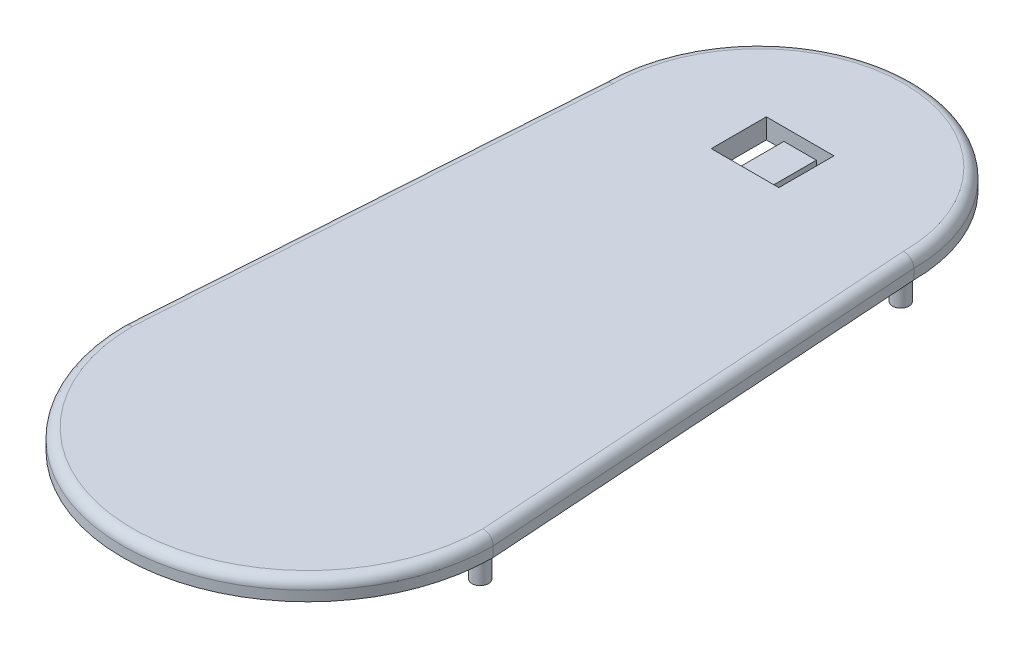
ISO-10303-21;
HEADER;
FILE_DESCRIPTION(('STEP AP214'),'2;1');
FILE_NAME('part.step','',(''),(''),'','','');
FILE_SCHEMA(('AUTOMOTIVE_DESIGN { 1 0 10303 214 1 1 1 1 }'));
ENDSEC;
DATA;
#1=APPLICATION_CONTEXT('core data for automotive mechanical design processes');
#2=APPLICATION_PROTOCOL_DEFINITION('international standard','automotive_design',2000,#1);
#3=PRODUCT_CONTEXT('',#1,'mechanical');
#4=PRODUCT('Part','Part','',(#3));
#5=PRODUCT_RELATED_PRODUCT_CATEGORY('part','',(#4));
#6=PRODUCT_DEFINITION_FORMATION('','',#4);
#7=PRODUCT_DEFINITION_CONTEXT('part definition',#1,'design');
#8=PRODUCT_DEFINITION('design','',#6,#7);
#9=PRODUCT_DEFINITION_SHAPE('','',#8);
#10=(LENGTH_UNIT() NAMED_UNIT(*) SI_UNIT(.MILLI.,.METRE.));
#11=(NAMED_UNIT(*) PLANE_ANGLE_UNIT() SI_UNIT($,.RADIAN.));
#12=(NAMED_UNIT(*) SI_UNIT($,.STERADIAN.) SOLID_ANGLE_UNIT());
#13=UNCERTAINTY_MEASURE_WITH_UNIT(LENGTH_MEASURE(1.E-05),#10,'distance_accuracy_value','');
#14=(GEOMETRIC_REPRESENTATION_CONTEXT(3) GLOBAL_UNCERTAINTY_ASSIGNED_CONTEXT((#13)) GLOBAL_UNIT_ASSIGNED_CONTEXT((#10,
#11,#12)) REPRESENTATION_CONTEXT('',''));
#15=CARTESIAN_POINT('',(0.,0.,0.));
#16=DIRECTION('',(0.,0.,1.));
#17=DIRECTION('',(1.,0.,0.));
#18=AXIS2_PLACEMENT_3D('',#15,#16,#17);
#19=CARTESIAN_POINT('',(33.8495575221239,4.,-2.25663716814159));
#20=DIRECTION('',(0.997785157856609,0.,-0.066519010523774));
#21=DIRECTION('',(-0.066519010523774,0.,-0.997785157856609));
#22=AXIS2_PLACEMENT_3D('',#19,#20,#21);
#23=PLANE('',#22);
#24=DIRECTION('',(0.,-1.,0.));
#25=VECTOR('',#24,1.);
#26=CARTESIAN_POINT('',(31.,4.,-45.));
#27=LINE('',#26,#25);
#28=CARTESIAN_POINT('',(31.,2.,-45.));
#29=VERTEX_POINT('',#28);
#30=CARTESIAN_POINT('',(31.,0.,-45.));
#31=VERTEX_POINT('',#30);
#32=EDGE_CURVE('E254',#29,#31,#27,.T.);
#33=ORIENTED_EDGE('',*,*,#32,.F.);
#34=DIRECTION('',(0.066519010523774,0.,0.997785157856609));
#35=VECTOR('',#34,1.);
#36=CARTESIAN_POINT('',(33.8495575221239,2.,-2.25663716814159));
#37=LINE('',#36,#35);
#38=CARTESIAN_POINT('',(37.,2.,45.));
#39=VERTEX_POINT('',#38);
#40=EDGE_CURVE('E74',#29,#39,#37,.T.);
#41=ORIENTED_EDGE('',*,*,#40,.T.);
#42=DIRECTION('',(0.,-1.,0.));
#43=VECTOR('',#42,1.);
#44=CARTESIAN_POINT('',(37.,4.,45.));
#45=LINE('',#44,#43);
#46=CARTESIAN_POINT('',(37.,0.,45.));
#47=VERTEX_POINT('',#46);
#48=EDGE_CURVE('E245',#39,#47,#45,.T.);
#49=ORIENTED_EDGE('',*,*,#48,.T.);
#50=DIRECTION('',(0.066519010523774,0.,0.997785157856609));
#51=VECTOR('',#50,1.);
#52=CARTESIAN_POINT('',(33.8495575221239,0.,-2.25663716814159));
#53=LINE('',#52,#51);
#54=EDGE_CURVE('E229',#31,#47,#53,.T.);
#55=ORIENTED_EDGE('',*,*,#54,.F.);
#56=EDGE_LOOP('',(#33,#41,#49,#55));
#57=FACE_BOUND('',#56,.T.);
#58=ADVANCED_FACE('F44',(#57),#23,.T.);
#59=CARTESIAN_POINT('',(0.,4.,-45.));
#60=DIRECTION('',(0.,-1.,0.));
#61=DIRECTION('',(0.,0.,-1.));
#62=AXIS2_PLACEMENT_3D('',#59,#60,#61);
#63=CYLINDRICAL_SURFACE('',#62,31.);
#64=DIRECTION('',(0.,-1.,0.));
#65=VECTOR('',#64,1.);
#66=CARTESIAN_POINT('',(-31.,4.,-45.));
#67=LINE('',#66,#65);
#68=CARTESIAN_POINT('',(-31.,2.,-45.));
#69=VERTEX_POINT('',#68);
#70=CARTESIAN_POINT('',(-31.,0.,-45.));
#71=VERTEX_POINT('',#70);
#72=EDGE_CURVE('E251',#69,#71,#67,.T.);
#73=ORIENTED_EDGE('',*,*,#72,.F.);
#74=CARTESIAN_POINT('',(0.,2.,-45.));
#75=DIRECTION('',(0.,1.,0.));
#76=DIRECTION('',(0.,0.,1.));
#77=AXIS2_PLACEMENT_3D('',#74,#75,#76);
#78=CIRCLE('',#77,31.);
#79=EDGE_CURVE('E315',#69,#29,#78,.F.);
#80=ORIENTED_EDGE('',*,*,#79,.T.);
#81=ORIENTED_EDGE('',*,*,#32,.T.);
#82=CARTESIAN_POINT('',(0.,0.,-45.));
#83=DIRECTION('',(0.,1.,0.));
#84=DIRECTION('',(0.,0.,1.));
#85=AXIS2_PLACEMENT_3D('',#82,#83,#84);
#86=CIRCLE('',#85,31.);
#87=EDGE_CURVE('E233',#31,#71,#86,.T.);
#88=ORIENTED_EDGE('',*,*,#87,.T.);
#89=EDGE_LOOP('',(#73,#80,#81,#88));
#90=FACE_BOUND('',#89,.T.);
#91=ADVANCED_FACE('F358',(#90),#63,.T.);
#92=CARTESIAN_POINT('',(-33.8495575221239,4.,-2.25663716814159));
#93=DIRECTION('',(0.997785157856609,0.,0.0665190105237738));
#94=DIRECTION('',(0.0665190105237738,0.,-0.997785157856609));
#95=AXIS2_PLACEMENT_3D('',#92,#93,#94);
#96=PLANE('',#95);
#97=DIRECTION('',(0.,-1.,0.));
#98=VECTOR('',#97,1.);
#99=CARTESIAN_POINT('',(-37.,4.,45.));
#100=LINE('',#99,#98);
#101=CARTESIAN_POINT('',(-37.,2.,45.));
#102=VERTEX_POINT('',#101);
#103=CARTESIAN_POINT('',(-37.,0.,45.));
#104=VERTEX_POINT('',#103);
#105=EDGE_CURVE('E248',#102,#104,#100,.T.);
#106=ORIENTED_EDGE('',*,*,#105,.F.);
#107=DIRECTION('',(-0.0665190105237738,0.,0.997785157856609));
#108=VECTOR('',#107,1.);
#109=CARTESIAN_POINT('',(-31.,2.,-45.));
#110=LINE('',#109,#108);
#111=EDGE_CURVE('E11',#102,#69,#110,.F.);
#112=ORIENTED_EDGE('',*,*,#111,.T.);
#113=ORIENTED_EDGE('',*,*,#72,.T.);
#114=DIRECTION('',(-0.0665190105237738,0.,0.997785157856609));
#115=VECTOR('',#114,1.);
#116=CARTESIAN_POINT('',(-33.8495575221239,0.,-2.25663716814159));
#117=LINE('',#116,#115);
#118=EDGE_CURVE('E237',#71,#104,#117,.T.);
#119=ORIENTED_EDGE('',*,*,#118,.T.);
#120=EDGE_LOOP('',(#106,#112,#113,#119));
#121=FACE_BOUND('',#120,.T.);
#122=ADVANCED_FACE('F363',(#121),#96,.F.);
#123=CARTESIAN_POINT('',(0.,4.,45.));
#124=DIRECTION('',(0.,-1.,0.));
#125=DIRECTION('',(0.,0.,-1.));
#126=AXIS2_PLACEMENT_3D('',#123,#124,#125);
#127=CYLINDRICAL_SURFACE('',#126,37.);
#128=ORIENTED_EDGE('',*,*,#48,.F.);
#129=CARTESIAN_POINT('',(0.,2.,45.));
#130=DIRECTION('',(0.,1.,0.));
#131=DIRECTION('',(0.,0.,1.));
#132=AXIS2_PLACEMENT_3D('',#129,#130,#131);
#133=CIRCLE('',#132,37.);
#134=EDGE_CURVE('E59',#39,#102,#133,.F.);
#135=ORIENTED_EDGE('',*,*,#134,.T.);
#136=ORIENTED_EDGE('',*,*,#105,.T.);
#137=CARTESIAN_POINT('',(0.,0.,45.));
#138=DIRECTION('',(0.,1.,0.));
#139=DIRECTION('',(0.,0.,1.));
#140=AXIS2_PLACEMENT_3D('',#137,#138,#139);
#141=CIRCLE('',#140,37.);
#142=EDGE_CURVE('E241',#104,#47,#141,.T.);
#143=ORIENTED_EDGE('',*,*,#142,.T.);
#144=EDGE_LOOP('',(#128,#135,#136,#143));
#145=FACE_BOUND('',#144,.T.);
#146=ADVANCED_FACE('F369',(#145),#127,.T.);
#147=CARTESIAN_POINT('',(0.,4.,0.));
#148=DIRECTION('',(0.,1.,0.));
#149=DIRECTION('',(0.,0.,1.));
#150=AXIS2_PLACEMENT_3D('',#147,#148,#149);
#151=PLANE('',#150);
#152=DIRECTION('',(0.066519010523774,0.,0.997785157856609));
#153=VECTOR('',#152,1.);
#154=CARTESIAN_POINT('',(31.8539872064107,4.,-2.12359914709405));
#155=LINE('',#154,#153);
#156=CARTESIAN_POINT('',(34.9999383945893,4.,45.0656686755856));
#157=VERTEX_POINT('',#156);
#158=CARTESIAN_POINT('',(28.9999260667579,4.,-44.9345162418861));
#159=VERTEX_POINT('',#158);
#160=EDGE_CURVE('E308',#157,#159,#155,.F.);
#161=ORIENTED_EDGE('',*,*,#160,.T.);
#162=CARTESIAN_POINT('',(0.,4.,-45.));
#163=DIRECTION('',(0.,1.,0.));
#164=DIRECTION('',(0.,0.,1.));
#165=AXIS2_PLACEMENT_3D('',#162,#163,#164);
#166=CIRCLE('',#165,29.);
#167=CARTESIAN_POINT('',(-28.9999260667579,4.,-44.9345162418859));
#168=VERTEX_POINT('',#167);
#169=EDGE_CURVE('E311',#159,#168,#166,.T.);
#170=ORIENTED_EDGE('',*,*,#169,.T.);
#171=DIRECTION('',(-0.0665190105237738,0.,0.997785157856609));
#172=VECTOR('',#171,1.);
#173=CARTESIAN_POINT('',(-35.0044296842868,4.,45.1330380210476));
#174=LINE('',#173,#172);
#175=CARTESIAN_POINT('',(-34.9999383945893,4.,45.0656686755856));
#176=VERTEX_POINT('',#175);
#177=EDGE_CURVE('E302',#168,#176,#174,.T.);
#178=ORIENTED_EDGE('',*,*,#177,.T.);
#179=CARTESIAN_POINT('',(0.,4.,45.));
#180=DIRECTION('',(0.,1.,0.));
#181=DIRECTION('',(0.,0.,1.));
#182=AXIS2_PLACEMENT_3D('',#179,#180,#181);
#183=CIRCLE('',#182,35.);
#184=EDGE_CURVE('E305',#176,#157,#183,.T.);
#185=ORIENTED_EDGE('',*,*,#184,.T.);
#186=EDGE_LOOP('',(#161,#170,#178,#185));
#187=FACE_BOUND('',#186,.T.);
#188=DIRECTION('',(0.,0.,-1.));
#189=VECTOR('',#188,1.);
#190=CARTESIAN_POINT('',(5.54341179462731,4.,-54.5081882234437));
#191=LINE('',#190,#189);
#192=CARTESIAN_POINT('',(5.54341179462731,4.,-43.5081882234437));
#193=VERTEX_POINT('',#192);
#194=CARTESIAN_POINT('',(5.54341179462731,4.,-54.5081882234437));
#195=VERTEX_POINT('',#194);
#196=EDGE_CURVE('E164',#193,#195,#191,.T.);
#197=ORIENTED_EDGE('',*,*,#196,.F.);
#198=DIRECTION('',(1.,0.,0.));
#199=VECTOR('',#198,1.);
#200=CARTESIAN_POINT('',(-7.95658820537269,4.,-43.5081882234437));
#201=LINE('',#200,#199);
#202=CARTESIAN_POINT('',(-7.95658820537269,4.,-43.5081882234437));
#203=VERTEX_POINT('',#202);
#204=EDGE_CURVE('E181',#203,#193,#201,.T.);
#205=ORIENTED_EDGE('',*,*,#204,.F.);
#206=DIRECTION('',(0.,0.,1.));
#207=VECTOR('',#206,1.);
#208=CARTESIAN_POINT('',(-7.95658820537269,4.,-54.5081882234437));
#209=LINE('',#208,#207);
#210=CARTESIAN_POINT('',(-7.95658820537269,4.,-54.5081882234437));
#211=VERTEX_POINT('',#210);
#212=EDGE_CURVE('E188',#211,#203,#209,.T.);
#213=ORIENTED_EDGE('',*,*,#212,.F.);
#214=DIRECTION('',(-1.,0.,0.));
#215=VECTOR('',#214,1.);
#216=CARTESIAN_POINT('',(-7.95658820537269,4.,-54.5081882234437));
#217=LINE('',#216,#215);
#218=EDGE_CURVE('E195',#195,#211,#217,.T.);
#219=ORIENTED_EDGE('',*,*,#218,.F.);
#220=EDGE_LOOP('',(#197,#205,#213,#219));
#221=FACE_BOUND('',#220,.T.);
#222=ADVANCED_FACE('F373',(#187,#221),#151,.T.);
#223=CARTESIAN_POINT('',(0.,0.,0.));
#224=DIRECTION('',(0.,1.,0.));
#225=DIRECTION('',(0.,0.,1.));
#226=AXIS2_PLACEMENT_3D('',#223,#224,#225);
#227=PLANE('',#226);
#228=DIRECTION('',(-1.,0.,0.));
#229=VECTOR('',#228,1.);
#230=CARTESIAN_POINT('',(0.,0.,-54.5081882234437));
#231=LINE('',#230,#229);
#232=CARTESIAN_POINT('',(-4.45658820537269,0.,-54.5081882234437));
#233=VERTEX_POINT('',#232);
#234=CARTESIAN_POINT('',(-7.95658820537269,0.,-54.5081882234437));
#235=VERTEX_POINT('',#234);
#236=EDGE_CURVE('E159',#233,#235,#231,.T.);
#237=ORIENTED_EDGE('',*,*,#236,.T.);
#238=DIRECTION('',(0.,0.,1.));
#239=VECTOR('',#238,1.);
#240=CARTESIAN_POINT('',(-7.95658820537269,0.,0.));
#241=LINE('',#240,#239);
#242=CARTESIAN_POINT('',(-7.95658820537269,0.,-43.5081882234437));
#243=VERTEX_POINT('',#242);
#244=EDGE_CURVE('E298',#235,#243,#241,.T.);
#245=ORIENTED_EDGE('',*,*,#244,.T.);
#246=DIRECTION('',(1.,0.,0.));
#247=VECTOR('',#246,1.);
#248=CARTESIAN_POINT('',(0.,0.,-43.5081882234437));
#249=LINE('',#248,#247);
#250=CARTESIAN_POINT('',(-4.45658820537269,0.,-43.5081882234437));
#251=VERTEX_POINT('',#250);
#252=EDGE_CURVE('E289',#243,#251,#249,.T.);
#253=ORIENTED_EDGE('',*,*,#252,.T.);
#254=DIRECTION('',(0.,0.,-1.));
#255=VECTOR('',#254,1.);
#256=CARTESIAN_POINT('',(-4.45658820537269,0.,0.));
#257=LINE('',#256,#255);
#258=EDGE_CURVE('E293',#251,#233,#257,.T.);
#259=ORIENTED_EDGE('',*,*,#258,.T.);
#260=EDGE_LOOP('',(#237,#245,#253,#259));
#261=FACE_BOUND('',#260,.T.);
#262=DIRECTION('',(1.,0.,0.));
#263=VECTOR('',#262,1.);
#264=CARTESIAN_POINT('',(0.,0.,-43.5081882234437));
#265=LINE('',#264,#263);
#266=CARTESIAN_POINT('',(2.04341179462731,0.,-43.5081882234437));
#267=VERTEX_POINT('',#266);
#268=CARTESIAN_POINT('',(5.54341179462731,0.,-43.5081882234437));
#269=VERTEX_POINT('',#268);
#270=EDGE_CURVE('E281',#267,#269,#265,.T.);
#271=ORIENTED_EDGE('',*,*,#270,.T.);
#272=DIRECTION('',(0.,0.,-1.));
#273=VECTOR('',#272,1.);
#274=CARTESIAN_POINT('',(5.54341179462731,0.,0.));
#275=LINE('',#274,#273);
#276=CARTESIAN_POINT('',(5.54341179462731,0.,-54.5081882234437));
#277=VERTEX_POINT('',#276);
#278=EDGE_CURVE('E285',#269,#277,#275,.T.);
#279=ORIENTED_EDGE('',*,*,#278,.T.);
#280=DIRECTION('',(-1.,0.,0.));
#281=VECTOR('',#280,1.);
#282=CARTESIAN_POINT('',(0.,0.,-54.5081882234437));
#283=LINE('',#282,#281);
#284=CARTESIAN_POINT('',(2.04341179462731,0.,-54.5081882234437));
#285=VERTEX_POINT('',#284);
#286=EDGE_CURVE('E273',#277,#285,#283,.T.);
#287=ORIENTED_EDGE('',*,*,#286,.T.);
#288=DIRECTION('',(0.,0.,1.));
#289=VECTOR('',#288,1.);
#290=CARTESIAN_POINT('',(2.04341179462731,0.,0.));
#291=LINE('',#290,#289);
#292=EDGE_CURVE('E277',#285,#267,#291,.T.);
#293=ORIENTED_EDGE('',*,*,#292,.T.);
#294=EDGE_LOOP('',(#271,#279,#287,#293));
#295=FACE_BOUND('',#294,.T.);
#296=CARTESIAN_POINT('',(-28.4,0.,-45.));
#297=DIRECTION('',(0.,1.,0.));
#298=DIRECTION('',(0.,0.,1.));
#299=AXIS2_PLACEMENT_3D('',#296,#297,#298);
#300=CIRCLE('',#299,1.65);
#301=CARTESIAN_POINT('',(-28.4,0.,-43.35));
#302=VERTEX_POINT('',#301);
#303=EDGE_CURVE('E269',#302,#302,#300,.F.);
#304=ORIENTED_EDGE('',*,*,#303,.F.);
#305=EDGE_LOOP('',(#304));
#306=FACE_BOUND('',#305,.T.);
#307=CARTESIAN_POINT('',(28.4,0.,-45.));
#308=DIRECTION('',(0.,1.,0.));
#309=DIRECTION('',(0.,0.,1.));
#310=AXIS2_PLACEMENT_3D('',#307,#308,#309);
#311=CIRCLE('',#310,1.65);
#312=CARTESIAN_POINT('',(28.4,0.,-43.35));
#313=VERTEX_POINT('',#312);
#314=EDGE_CURVE('E265',#313,#313,#311,.F.);
#315=ORIENTED_EDGE('',*,*,#314,.F.);
#316=EDGE_LOOP('',(#315));
#317=FACE_BOUND('',#316,.T.);
#318=CARTESIAN_POINT('',(34.4,0.,45.));
#319=DIRECTION('',(0.,1.,0.));
#320=DIRECTION('',(0.,0.,1.));
#321=AXIS2_PLACEMENT_3D('',#318,#319,#320);
#322=CIRCLE('',#321,1.65);
#323=CARTESIAN_POINT('',(34.4,0.,46.65));
#324=VERTEX_POINT('',#323);
#325=EDGE_CURVE('E261',#324,#324,#322,.F.);
#326=ORIENTED_EDGE('',*,*,#325,.F.);
#327=EDGE_LOOP('',(#326));
#328=FACE_BOUND('',#327,.T.);
#329=CARTESIAN_POINT('',(-34.4,0.,45.));
#330=DIRECTION('',(0.,1.,0.));
#331=DIRECTION('',(0.,0.,1.));
#332=AXIS2_PLACEMENT_3D('',#329,#330,#331);
#333=CIRCLE('',#332,1.65);
#334=CARTESIAN_POINT('',(-34.4,0.,46.65));
#335=VERTEX_POINT('',#334);
#336=EDGE_CURVE('E257',#335,#335,#333,.F.);
#337=ORIENTED_EDGE('',*,*,#336,.F.);
#338=EDGE_LOOP('',(#337));
#339=FACE_BOUND('',#338,.T.);
#340=ORIENTED_EDGE('',*,*,#54,.T.);
#341=ORIENTED_EDGE('',*,*,#142,.F.);
#342=ORIENTED_EDGE('',*,*,#118,.F.);
#343=ORIENTED_EDGE('',*,*,#87,.F.);
#344=EDGE_LOOP('',(#340,#341,#342,#343));
#345=FACE_BOUND('',#344,.T.);
#346=ADVANCED_FACE('F374',(#261,#295,#306,#317,#328,#339,#345),#227,.F.);
#347=CARTESIAN_POINT('',(-34.4,-5.,45.));
#348=DIRECTION('',(0.,1.,0.));
#349=DIRECTION('',(0.,0.,1.));
#350=AXIS2_PLACEMENT_3D('',#347,#348,#349);
#351=CYLINDRICAL_SURFACE('',#350,1.65);
#352=CARTESIAN_POINT('',(-34.4,-5.,45.));
#353=DIRECTION('',(0.,-1.,0.));
#354=DIRECTION('',(0.,0.,-1.));
#355=AXIS2_PLACEMENT_3D('',#352,#353,#354);
#356=CIRCLE('',#355,1.65);
#357=CARTESIAN_POINT('',(-34.4,-5.,43.35));
#358=VERTEX_POINT('',#357);
#359=EDGE_CURVE('E225',#358,#358,#356,.T.);
#360=ORIENTED_EDGE('',*,*,#359,.F.);
#361=EDGE_LOOP('',(#360));
#362=FACE_BOUND('',#361,.T.);
#363=ORIENTED_EDGE('',*,*,#336,.T.);
#364=EDGE_LOOP('',(#363));
#365=FACE_BOUND('',#364,.T.);
#366=ADVANCED_FACE('F377',(#362,#365),#351,.T.);
#367=CARTESIAN_POINT('',(-34.4,-5.,45.));
#368=DIRECTION('',(0.,-1.,0.));
#369=DIRECTION('',(0.,0.,-1.));
#370=AXIS2_PLACEMENT_3D('',#367,#368,#369);
#371=PLANE('',#370);
#372=ORIENTED_EDGE('',*,*,#359,.T.);
#373=EDGE_LOOP('',(#372));
#374=FACE_BOUND('',#373,.T.);
#375=ADVANCED_FACE('F384',(#374),#371,.T.);
#376=CARTESIAN_POINT('',(34.4,-5.,45.));
#377=DIRECTION('',(0.,1.,0.));
#378=DIRECTION('',(0.,0.,1.));
#379=AXIS2_PLACEMENT_3D('',#376,#377,#378);
#380=CYLINDRICAL_SURFACE('',#379,1.65);
#381=CARTESIAN_POINT('',(34.4,-5.,45.));
#382=DIRECTION('',(0.,-1.,0.));
#383=DIRECTION('',(0.,0.,-1.));
#384=AXIS2_PLACEMENT_3D('',#381,#382,#383);
#385=CIRCLE('',#384,1.65);
#386=CARTESIAN_POINT('',(34.4,-5.,43.35));
#387=VERTEX_POINT('',#386);
#388=EDGE_CURVE('E221',#387,#387,#385,.T.);
#389=ORIENTED_EDGE('',*,*,#388,.F.);
#390=EDGE_LOOP('',(#389));
#391=FACE_BOUND('',#390,.T.);
#392=ORIENTED_EDGE('',*,*,#325,.T.);
#393=EDGE_LOOP('',(#392));
#394=FACE_BOUND('',#393,.T.);
#395=ADVANCED_FACE('F388',(#391,#394),#380,.T.);
#396=CARTESIAN_POINT('',(34.4,-5.,45.));
#397=DIRECTION('',(0.,-1.,0.));
#398=DIRECTION('',(0.,0.,-1.));
#399=AXIS2_PLACEMENT_3D('',#396,#397,#398);
#400=PLANE('',#399);
#401=ORIENTED_EDGE('',*,*,#388,.T.);
#402=EDGE_LOOP('',(#401));
#403=FACE_BOUND('',#402,.T.);
#404=ADVANCED_FACE('F390',(#403),#400,.T.);
#405=CARTESIAN_POINT('',(28.4,-5.,-45.));
#406=DIRECTION('',(0.,1.,0.));
#407=DIRECTION('',(0.,0.,1.));
#408=AXIS2_PLACEMENT_3D('',#405,#406,#407);
#409=CYLINDRICAL_SURFACE('',#408,1.65);
#410=CARTESIAN_POINT('',(28.4,-5.,-45.));
#411=DIRECTION('',(0.,-1.,0.));
#412=DIRECTION('',(0.,0.,-1.));
#413=AXIS2_PLACEMENT_3D('',#410,#411,#412);
#414=CIRCLE('',#413,1.65);
#415=CARTESIAN_POINT('',(28.4,-5.,-46.65));
#416=VERTEX_POINT('',#415);
#417=EDGE_CURVE('E217',#416,#416,#414,.T.);
#418=ORIENTED_EDGE('',*,*,#417,.F.);
#419=EDGE_LOOP('',(#418));
#420=FACE_BOUND('',#419,.T.);
#421=ORIENTED_EDGE('',*,*,#314,.T.);
#422=EDGE_LOOP('',(#421));
#423=FACE_BOUND('',#422,.T.);
#424=ADVANCED_FACE('F393',(#420,#423),#409,.T.);
#425=CARTESIAN_POINT('',(28.4,-5.,-45.));
#426=DIRECTION('',(0.,-1.,0.));
#427=DIRECTION('',(0.,0.,-1.));
#428=AXIS2_PLACEMENT_3D('',#425,#426,#427);
#429=PLANE('',#428);
#430=ORIENTED_EDGE('',*,*,#417,.T.);
#431=EDGE_LOOP('',(#430));
#432=FACE_BOUND('',#431,.T.);
#433=ADVANCED_FACE('F398',(#432),#429,.T.);
#434=CARTESIAN_POINT('',(-28.4,-5.,-45.));
#435=DIRECTION('',(0.,1.,0.));
#436=DIRECTION('',(0.,0.,1.));
#437=AXIS2_PLACEMENT_3D('',#434,#435,#436);
#438=CYLINDRICAL_SURFACE('',#437,1.65);
#439=CARTESIAN_POINT('',(-28.4,-5.,-45.));
#440=DIRECTION('',(0.,-1.,0.));
#441=DIRECTION('',(0.,0.,-1.));
#442=AXIS2_PLACEMENT_3D('',#439,#440,#441);
#443=CIRCLE('',#442,1.65);
#444=CARTESIAN_POINT('',(-28.4,-5.,-46.65));
#445=VERTEX_POINT('',#444);
#446=EDGE_CURVE('E204',#445,#445,#443,.T.);
#447=ORIENTED_EDGE('',*,*,#446,.F.);
#448=EDGE_LOOP('',(#447));
#449=FACE_BOUND('',#448,.T.);
#450=ORIENTED_EDGE('',*,*,#303,.T.);
#451=EDGE_LOOP('',(#450));
#452=FACE_BOUND('',#451,.T.);
#453=ADVANCED_FACE('F401',(#449,#452),#438,.T.);
#454=CARTESIAN_POINT('',(-28.4,-5.,-45.));
#455=DIRECTION('',(0.,-1.,0.));
#456=DIRECTION('',(0.,0.,-1.));
#457=AXIS2_PLACEMENT_3D('',#454,#455,#456);
#458=PLANE('',#457);
#459=ORIENTED_EDGE('',*,*,#446,.T.);
#460=EDGE_LOOP('',(#459));
#461=FACE_BOUND('',#460,.T.);
#462=ADVANCED_FACE('F406',(#461),#458,.T.);
#463=CARTESIAN_POINT('',(5.54341179462731,1.5,-54.5081882234437));
#464=DIRECTION('',(1.,0.,0.));
#465=DIRECTION('',(0.,0.,-1.));
#466=AXIS2_PLACEMENT_3D('',#463,#464,#465);
#467=PLANE('',#466);
#468=ORIENTED_EDGE('',*,*,#196,.T.);
#469=DIRECTION('',(0.,1.,0.));
#470=VECTOR('',#469,1.);
#471=CARTESIAN_POINT('',(5.54341179462731,1.5,-54.5081882234437));
#472=LINE('',#471,#470);
#473=EDGE_CURVE('E185',#277,#195,#472,.T.);
#474=ORIENTED_EDGE('',*,*,#473,.F.);
#475=ORIENTED_EDGE('',*,*,#278,.F.);
#476=DIRECTION('',(0.,1.,0.));
#477=VECTOR('',#476,1.);
#478=CARTESIAN_POINT('',(5.54341179462731,1.5,-43.5081882234437));
#479=LINE('',#478,#477);
#480=EDGE_CURVE('E201',#269,#193,#479,.T.);
#481=ORIENTED_EDGE('',*,*,#480,.T.);
#482=EDGE_LOOP('',(#468,#474,#475,#481));
#483=FACE_BOUND('',#482,.T.);
#484=ADVANCED_FACE('F409',(#483),#467,.F.);
#485=CARTESIAN_POINT('',(-7.95658820537269,1.5,-43.5081882234437));
#486=DIRECTION('',(0.,0.,1.));
#487=DIRECTION('',(1.,0.,0.));
#488=AXIS2_PLACEMENT_3D('',#485,#486,#487);
#489=PLANE('',#488);
#490=ORIENTED_EDGE('',*,*,#204,.T.);
#491=ORIENTED_EDGE('',*,*,#480,.F.);
#492=ORIENTED_EDGE('',*,*,#270,.F.);
#493=DIRECTION('',(0.,1.,0.));
#494=VECTOR('',#493,1.);
#495=CARTESIAN_POINT('',(2.04341179462731,-7.,-43.5081882234437));
#496=LINE('',#495,#494);
#497=CARTESIAN_POINT('',(2.04341179462731,1.5,-43.5081882234437));
#498=VERTEX_POINT('',#497);
#499=EDGE_CURVE('E670',#267,#498,#496,.T.);
#500=ORIENTED_EDGE('',*,*,#499,.T.);
#501=DIRECTION('',(1.,0.,0.));
#502=VECTOR('',#501,1.);
#503=CARTESIAN_POINT('',(-7.95658820537269,1.5,-43.5081882234437));
#504=LINE('',#503,#502);
#505=CARTESIAN_POINT('',(-4.45658820537269,1.5,-43.5081882234437));
#506=VERTEX_POINT('',#505);
#507=EDGE_CURVE('E180',#506,#498,#504,.T.);
#508=ORIENTED_EDGE('',*,*,#507,.F.);
#509=DIRECTION('',(0.,1.,0.));
#510=VECTOR('',#509,1.);
#511=CARTESIAN_POINT('',(-4.45658820537269,-7.,-43.5081882234437));
#512=LINE('',#511,#510);
#513=EDGE_CURVE('E165',#251,#506,#512,.T.);
#514=ORIENTED_EDGE('',*,*,#513,.F.);
#515=ORIENTED_EDGE('',*,*,#252,.F.);
#516=DIRECTION('',(0.,1.,0.));
#517=VECTOR('',#516,1.);
#518=CARTESIAN_POINT('',(-7.95658820537269,1.5,-43.5081882234437));
#519=LINE('',#518,#517);
#520=EDGE_CURVE('E205',#243,#203,#519,.T.);
#521=ORIENTED_EDGE('',*,*,#520,.T.);
#522=EDGE_LOOP('',(#490,#491,#492,#500,#508,#514,#515,#521));
#523=FACE_BOUND('',#522,.T.);
#524=ADVANCED_FACE('F416',(#523),#489,.F.);
#525=CARTESIAN_POINT('',(-7.95658820537269,1.5,-54.5081882234437));
#526=DIRECTION('',(-1.,0.,0.));
#527=DIRECTION('',(0.,0.,1.));
#528=AXIS2_PLACEMENT_3D('',#525,#526,#527);
#529=PLANE('',#528);
#530=ORIENTED_EDGE('',*,*,#212,.T.);
#531=ORIENTED_EDGE('',*,*,#520,.F.);
#532=ORIENTED_EDGE('',*,*,#244,.F.);
#533=DIRECTION('',(0.,1.,0.));
#534=VECTOR('',#533,1.);
#535=CARTESIAN_POINT('',(-7.95658820537269,1.5,-54.5081882234437));
#536=LINE('',#535,#534);
#537=EDGE_CURVE('E208',#235,#211,#536,.T.);
#538=ORIENTED_EDGE('',*,*,#537,.T.);
#539=EDGE_LOOP('',(#530,#531,#532,#538));
#540=FACE_BOUND('',#539,.T.);
#541=ADVANCED_FACE('F420',(#540),#529,.F.);
#542=CARTESIAN_POINT('',(-7.95658820537269,1.5,-54.5081882234437));
#543=DIRECTION('',(0.,0.,-1.));
#544=DIRECTION('',(-1.,0.,0.));
#545=AXIS2_PLACEMENT_3D('',#542,#543,#544);
#546=PLANE('',#545);
#547=ORIENTED_EDGE('',*,*,#218,.T.);
#548=ORIENTED_EDGE('',*,*,#537,.F.);
#549=ORIENTED_EDGE('',*,*,#236,.F.);
#550=DIRECTION('',(0.,1.,0.));
#551=VECTOR('',#550,1.);
#552=CARTESIAN_POINT('',(-4.45658820537269,-7.,-54.5081882234437));
#553=LINE('',#552,#551);
#554=CARTESIAN_POINT('',(-4.45658820537269,1.5,-54.5081882234437));
#555=VERTEX_POINT('',#554);
#556=EDGE_CURVE('E152',#233,#555,#553,.T.);
#557=ORIENTED_EDGE('',*,*,#556,.T.);
#558=DIRECTION('',(-1.,0.,0.));
#559=VECTOR('',#558,1.);
#560=CARTESIAN_POINT('',(-7.95658820537269,1.5,-54.5081882234437));
#561=LINE('',#560,#559);
#562=CARTESIAN_POINT('',(2.04341179462731,1.5,-54.5081882234437));
#563=VERTEX_POINT('',#562);
#564=EDGE_CURVE('E157',#563,#555,#561,.T.);
#565=ORIENTED_EDGE('',*,*,#564,.F.);
#566=DIRECTION('',(0.,1.,0.));
#567=VECTOR('',#566,1.);
#568=CARTESIAN_POINT('',(2.04341179462731,-7.,-54.5081882234437));
#569=LINE('',#568,#567);
#570=EDGE_CURVE('E666',#285,#563,#569,.T.);
#571=ORIENTED_EDGE('',*,*,#570,.F.);
#572=ORIENTED_EDGE('',*,*,#286,.F.);
#573=ORIENTED_EDGE('',*,*,#473,.T.);
#574=EDGE_LOOP('',(#547,#548,#549,#557,#565,#571,#572,#573));
#575=FACE_BOUND('',#574,.T.);
#576=ADVANCED_FACE('F155',(#575),#546,.F.);
#577=CARTESIAN_POINT('',(0.,1.5,0.));
#578=DIRECTION('',(0.,1.,0.));
#579=DIRECTION('',(0.,0.,1.));
#580=AXIS2_PLACEMENT_3D('',#577,#578,#579);
#581=PLANE('',#580);
#582=DIRECTION('',(0.,0.,-1.));
#583=VECTOR('',#582,1.);
#584=CARTESIAN_POINT('',(-4.45658820537269,1.5,-54.5081882234437));
#585=LINE('',#584,#583);
#586=EDGE_CURVE('E168',#506,#555,#585,.T.);
#587=ORIENTED_EDGE('',*,*,#586,.F.);
#588=ORIENTED_EDGE('',*,*,#507,.T.);
#589=DIRECTION('',(0.,0.,1.));
#590=VECTOR('',#589,1.);
#591=CARTESIAN_POINT('',(2.04341179462731,1.5,-54.5081882234437));
#592=LINE('',#591,#590);
#593=EDGE_CURVE('E174',#563,#498,#592,.T.);
#594=ORIENTED_EDGE('',*,*,#593,.F.);
#595=ORIENTED_EDGE('',*,*,#564,.T.);
#596=EDGE_LOOP('',(#587,#588,#594,#595));
#597=FACE_BOUND('',#596,.T.);
#598=ADVANCED_FACE('F177',(#597),#581,.T.);
#599=CARTESIAN_POINT('',(2.04341179462731,-7.,-54.5081882234437));
#600=DIRECTION('',(-1.,0.,0.));
#601=DIRECTION('',(0.,0.,1.));
#602=AXIS2_PLACEMENT_3D('',#599,#600,#601);
#603=PLANE('',#602);
#604=ORIENTED_EDGE('',*,*,#570,.T.);
#605=ORIENTED_EDGE('',*,*,#593,.T.);
#606=ORIENTED_EDGE('',*,*,#499,.F.);
#607=ORIENTED_EDGE('',*,*,#292,.F.);
#608=EDGE_LOOP('',(#604,#605,#606,#607));
#609=FACE_BOUND('',#608,.T.);
#610=ADVANCED_FACE('F429',(#609),#603,.F.);
#611=CARTESIAN_POINT('',(-4.45658820537269,-7.,-54.5081882234437));
#612=DIRECTION('',(1.,0.,0.));
#613=DIRECTION('',(0.,0.,-1.));
#614=AXIS2_PLACEMENT_3D('',#611,#612,#613);
#615=PLANE('',#614);
#616=ORIENTED_EDGE('',*,*,#513,.T.);
#617=ORIENTED_EDGE('',*,*,#586,.T.);
#618=ORIENTED_EDGE('',*,*,#556,.F.);
#619=ORIENTED_EDGE('',*,*,#258,.F.);
#620=EDGE_LOOP('',(#616,#617,#618,#619));
#621=FACE_BOUND('',#620,.T.);
#622=ADVANCED_FACE('F169',(#621),#615,.F.);
#623=CARTESIAN_POINT('',(0.,2.,45.));
#624=DIRECTION('',(0.,1.,0.));
#625=DIRECTION('',(0.,0.,1.));
#626=AXIS2_PLACEMENT_3D('',#623,#624,#625);
#627=TOROIDAL_SURFACE('',#626,35.,2.);
#628=CARTESIAN_POINT('',(-37.,2.,45.));
#629=CARTESIAN_POINT('',(-36.9999996402275,2.05624475087798,44.9999999996362));
#630=CARTESIAN_POINT('',(-36.997625905687,2.11246254691495,45.0000790501016));
#631=CARTESIAN_POINT('',(-36.9881562152748,2.2244957173092,45.0003943310133));
#632=CARTESIAN_POINT('',(-36.9810604904043,2.2803111112171,45.0006305537707));
#633=CARTESIAN_POINT('',(-36.9527569309834,2.44646218662946,45.0015726058552));
#634=CARTESIAN_POINT('',(-36.9245325306133,2.55568457998845,45.0025118256522));
#635=CARTESIAN_POINT('',(-36.8501589887517,2.76783386641287,45.0049844054091));
#636=CARTESIAN_POINT('',(-36.8040013930819,2.87075776367332,45.0065180455937));
#637=CARTESIAN_POINT('',(-36.6950828346633,3.06738474222426,45.010132283248));
#638=CARTESIAN_POINT('',(-36.6323257489039,3.16108996963203,45.0122127529992));
#639=CARTESIAN_POINT('',(-36.4919762583318,3.33664918037004,45.0168579479759));
#640=CARTESIAN_POINT('',(-36.4143810399443,3.41850091088459,45.0194227650412));
#641=CARTESIAN_POINT('',(-36.2465332609208,3.56804608268895,45.02496016205));
#642=CARTESIAN_POINT('',(-36.156276381694,3.63573467356055,45.0279328811116));
#643=CARTESIAN_POINT('',(-35.9656274668812,3.75504849587628,45.0341985909773));
#644=CARTESIAN_POINT('',(-35.8652272642144,3.80666064435226,45.0374918397824));
#645=CARTESIAN_POINT('',(-35.6572352396131,3.89225346192834,45.0442981431823));
#646=CARTESIAN_POINT('',(-35.5496500165224,3.926250064745,45.0478109959046));
#647=CARTESIAN_POINT('',(-35.3734156145736,3.96601536156408,45.0535510965578));
#648=CARTESIAN_POINT('',(-35.3060211778387,3.97762484211189,45.0557429651271));
#649=CARTESIAN_POINT('',(-35.170463755609,3.99388259698973,45.0601449530956));
#650=CARTESIAN_POINT('',(-35.1023020840596,3.99854135463697,45.0623550399442));
#651=CARTESIAN_POINT('',(-35.0227273495584,3.9999028424499,45.0649311929654));
#652=CARTESIAN_POINT('',(-35.011332158401,4.00000025818689,45.065300005429));
#653=CARTESIAN_POINT('',(-34.9999383945892,4.,45.0656686755856));
#654=B_SPLINE_CURVE_WITH_KNOTS('',3,(#628,#629,#630,#631,#632,#633,#634,#635,#636,#637,#638,
#639,#640,#641,#642,#643,#644,#645,#646,#647,#648,#649,#650,#651,#652,#653),.UNSPECIFIED.,.F.,
.F.,(4,2,2,2,2,2,2,2,2,2,2,2,4),(0.,0.168630585363181,0.337252921872603,0.673959084564118,
1.01082417234473,1.34761065102941,1.68446105388208,2.02142662899216,2.35866571368872,
2.69559922205954,2.90056100753187,3.1052133490446,3.13941612864967),.UNSPECIFIED.);
#655=EDGE_CURVE('E677',#102,#176,#654,.T.);
#656=ORIENTED_EDGE('',*,*,#655,.F.);
#657=ORIENTED_EDGE('',*,*,#134,.F.);
#658=CARTESIAN_POINT('',(37.,2.,45.));
#659=CARTESIAN_POINT('',(36.9999996402275,2.05624475087798,44.999999999636));
#660=CARTESIAN_POINT('',(36.997625905687,2.11246254691495,45.0000790501014));
#661=CARTESIAN_POINT('',(36.9881562152748,2.2244957173092,45.0003943310131));
#662=CARTESIAN_POINT('',(36.9810604904043,2.2803111112171,45.0006305537704));
#663=CARTESIAN_POINT('',(36.9527569309834,2.44646218662946,45.001572605855));
#664=CARTESIAN_POINT('',(36.9245325306133,2.55568457998845,45.002511825652));
#665=CARTESIAN_POINT('',(36.8501589887517,2.76783386641287,45.0049844054089));
#666=CARTESIAN_POINT('',(36.8040013930819,2.87075776367332,45.0065180455934));
#667=CARTESIAN_POINT('',(36.6950828346633,3.06738474222426,45.0101322832478));
#668=CARTESIAN_POINT('',(36.6323257489039,3.16108996963203,45.0122127529991));
#669=CARTESIAN_POINT('',(36.4919762583318,3.33664918037004,45.0168579479758));
#670=CARTESIAN_POINT('',(36.4143810399443,3.41850091088459,45.0194227650412));
#671=CARTESIAN_POINT('',(36.2465332609208,3.56804608268895,45.0249601620499));
#672=CARTESIAN_POINT('',(36.156276381694,3.63573467356055,45.0279328811114));
#673=CARTESIAN_POINT('',(35.9656274668812,3.75504849587628,45.034198590977));
#674=CARTESIAN_POINT('',(35.8652272642144,3.80666064435226,45.0374918397822));
#675=CARTESIAN_POINT('',(35.6572352396131,3.89225346192834,45.0442981431822));
#676=CARTESIAN_POINT('',(35.5496500165224,3.926250064745,45.0478109959045));
#677=CARTESIAN_POINT('',(35.3734156145736,3.96601536156408,45.0535510965577));
#678=CARTESIAN_POINT('',(35.3060211778387,3.97762484211188,45.0557429651269));
#679=CARTESIAN_POINT('',(35.170463755609,3.99388259698973,45.0601449530954));
#680=CARTESIAN_POINT('',(35.1023020840596,3.99854135463697,45.062355039944));
#681=CARTESIAN_POINT('',(35.0227273495584,3.9999028424499,45.0649311929654));
#682=CARTESIAN_POINT('',(35.011332158401,4.00000025818689,45.065300005429));
#683=CARTESIAN_POINT('',(34.9999383945892,4.,45.0656686755856));
#684=B_SPLINE_CURVE_WITH_KNOTS('',3,(#658,#659,#660,#661,#662,#663,#664,#665,#666,#667,#668,
#669,#670,#671,#672,#673,#674,#675,#676,#677,#678,#679,#680,#681,#682,#683),.UNSPECIFIED.,.F.,
.F.,(4,2,2,2,2,2,2,2,2,2,2,2,4),(0.,0.168630585363181,0.337252921872603,0.673959084564118,
1.01082417234473,1.34761065102941,1.68446105388208,2.02142662899216,2.35866571368871,
2.69559922205954,2.90056100753186,3.1052133490446,3.13941612864967),.UNSPECIFIED.);
#685=EDGE_CURVE('E49',#157,#39,#684,.F.);
#686=ORIENTED_EDGE('',*,*,#685,.F.);
#687=ORIENTED_EDGE('',*,*,#184,.F.);
#688=EDGE_LOOP('',(#656,#657,#686,#687));
#689=FACE_BOUND('',#688,.T.);
#690=ADVANCED_FACE('F46',(#689),#627,.T.);
#691=CARTESIAN_POINT('',(31.8539872064107,2.,-2.12359914709405));
#692=DIRECTION('',(0.066519010523774,0.,0.997785157856609));
#693=DIRECTION('',(0.997785157856609,0.,-0.066519010523774));
#694=AXIS2_PLACEMENT_3D('',#691,#692,#693);
#695=CYLINDRICAL_SURFACE('',#694,2.);
#696=ORIENTED_EDGE('',*,*,#685,.T.);
#697=ORIENTED_EDGE('',*,*,#40,.F.);
#698=CARTESIAN_POINT('',(31.,2.,-45.));
#699=CARTESIAN_POINT('',(30.9999996400598,2.05624471533865,-45.0000000027451));
#700=CARTESIAN_POINT('',(30.9976259087003,2.11246247589207,-44.999920949734));
#701=CARTESIAN_POINT('',(30.9881562298916,2.2244955763233,-44.9996056741457));
#702=CARTESIAN_POINT('',(30.9810605134189,2.28031093574962,-44.9993694592561));
#703=CARTESIAN_POINT('',(30.9527569841352,2.44646191390623,-44.9984274766964));
#704=CARTESIAN_POINT('',(30.9245326104621,2.55568424632587,-44.9974883643569));
#705=CARTESIAN_POINT('',(30.8501591094469,2.76783341751354,-44.9950165213988));
#706=CARTESIAN_POINT('',(30.8040015276204,2.87075726037236,-44.9934835107921));
#707=CARTESIAN_POINT('',(30.6950829523551,3.06738412847269,-44.9898716785359));
#708=CARTESIAN_POINT('',(30.6323258357637,3.16108929974776,-44.9877929843327));
#709=CARTESIAN_POINT('',(30.4919762663426,3.33664832261955,-44.9831532513623));
#710=CARTESIAN_POINT('',(30.4143810110266,3.41849993028789,-44.9805921214788));
#711=CARTESIAN_POINT('',(30.2465331062934,3.56804486367993,-44.9750648183677));
#712=CARTESIAN_POINT('',(30.1562761401925,3.63573334115869,-44.9720985070132));
#713=CARTESIAN_POINT('',(29.9656269611779,3.75504700419784,-44.9658490711066));
#714=CARTESIAN_POINT('',(29.865226579752,3.80665910464632,-44.9625656913141));
#715=CARTESIAN_POINT('',(29.6572340518052,3.89225196997748,-44.9557831349631));
#716=CARTESIAN_POINT('',(29.5496484992243,3.92624865646854,-44.9522841564849));
#717=CARTESIAN_POINT('',(29.3733966194334,3.96601802871438,-44.9465692151692));
#718=CARTESIAN_POINT('',(29.3059847200071,3.97762971253523,-44.9443872938086));
#719=CARTESIAN_POINT('',(29.1703921077561,3.99388841887583,-44.9400067393876));
#720=CARTESIAN_POINT('',(29.1022127099592,3.99854593450562,-44.9378081365468));
#721=CARTESIAN_POINT('',(29.0226519577756,3.99990338200072,-44.9352473605177));
#722=CARTESIAN_POINT('',(29.0112883025053,4.00000025672174,-44.9348817203689));
#723=CARTESIAN_POINT('',(28.9999260667581,4.,-44.9345162418861));
#724=B_SPLINE_CURVE_WITH_KNOTS('',3,(#698,#699,#700,#701,#702,#703,#704,#705,#706,#707,#708,
#709,#710,#711,#712,#713,#714,#715,#716,#717,#718,#719,#720,#721,#722,#723),.UNSPECIFIED.,.F.,
.F.,(4,2,2,2,2,2,2,2,2,2,2,2,4),(0.,0.168630478931557,0.337252709888779,0.673958674364917,
1.01082356948716,1.34760985864778,1.68445981973204,2.02142490147966,2.35866353822129,
2.69559682936865,2.90061014511727,3.10531380356362,3.13942172334547),.UNSPECIFIED.);
#725=EDGE_CURVE('E332',#159,#29,#724,.F.);
#726=ORIENTED_EDGE('',*,*,#725,.F.);
#727=ORIENTED_EDGE('',*,*,#160,.F.);
#728=EDGE_LOOP('',(#696,#697,#726,#727));
#729=FACE_BOUND('',#728,.T.);
#730=ADVANCED_FACE('F344',(#729),#695,.T.);
#731=CARTESIAN_POINT('',(-31.8539872064107,2.,-2.12359914709404));
#732=DIRECTION('',(0.0665190105237738,0.,-0.997785157856609));
#733=DIRECTION('',(-0.997785157856609,0.,-0.0665190105237738));
#734=AXIS2_PLACEMENT_3D('',#731,#732,#733);
#735=CYLINDRICAL_SURFACE('',#734,2.);
#736=ORIENTED_EDGE('',*,*,#655,.T.);
#737=ORIENTED_EDGE('',*,*,#177,.F.);
#738=CARTESIAN_POINT('',(-31.,2.,-45.));
#739=CARTESIAN_POINT('',(-30.9999996400599,2.05624471533865,-45.000000002745));
#740=CARTESIAN_POINT('',(-30.9976259087004,2.11246247589207,-44.9999209497338));
#741=CARTESIAN_POINT('',(-30.9881562298916,2.2244955763233,-44.9996056741454));
#742=CARTESIAN_POINT('',(-30.9810605134189,2.28031093574962,-44.9993694592558));
#743=CARTESIAN_POINT('',(-30.9527569841352,2.44646191390623,-44.9984274766962));
#744=CARTESIAN_POINT('',(-30.9245326104621,2.55568424632587,-44.9974883643567));
#745=CARTESIAN_POINT('',(-30.8501591094469,2.76783341751354,-44.9950165213986));
#746=CARTESIAN_POINT('',(-30.8040015276204,2.87075726037236,-44.9934835107918));
#747=CARTESIAN_POINT('',(-30.6950829523551,3.06738412847269,-44.9898716785357));
#748=CARTESIAN_POINT('',(-30.6323258357637,3.16108929974776,-44.9877929843325));
#749=CARTESIAN_POINT('',(-30.4919762663426,3.33664832261955,-44.9831532513621));
#750=CARTESIAN_POINT('',(-30.4143810110266,3.4184999302879,-44.9805921214785));
#751=CARTESIAN_POINT('',(-30.2465331062934,3.56804486367993,-44.9750648183675));
#752=CARTESIAN_POINT('',(-30.1562761401925,3.63573334115869,-44.9720985070131));
#753=CARTESIAN_POINT('',(-29.9656269611779,3.75504700419784,-44.9658490711064));
#754=CARTESIAN_POINT('',(-29.865226579752,3.80665910464632,-44.9625656913139));
#755=CARTESIAN_POINT('',(-29.6572340518052,3.89225196997748,-44.9557831349629));
#756=CARTESIAN_POINT('',(-29.5496484992243,3.92624865646854,-44.9522841564848));
#757=CARTESIAN_POINT('',(-29.3733966194334,3.96601802871439,-44.9465692151689));
#758=CARTESIAN_POINT('',(-29.3059847200071,3.97762971253523,-44.9443872938082));
#759=CARTESIAN_POINT('',(-29.1703921077561,3.99388841887583,-44.9400067393875));
#760=CARTESIAN_POINT('',(-29.1022127099591,3.99854593450562,-44.9378081365473));
#761=CARTESIAN_POINT('',(-29.0226519577755,3.99990338200072,-44.9352473605177));
#762=CARTESIAN_POINT('',(-29.0112883025052,4.00000025672174,-44.9348817203689));
#763=CARTESIAN_POINT('',(-28.999926066758,4.,-44.9345162418859));
#764=B_SPLINE_CURVE_WITH_KNOTS('',3,(#738,#739,#740,#741,#742,#743,#744,#745,#746,#747,#748,
#749,#750,#751,#752,#753,#754,#755,#756,#757,#758,#759,#760,#761,#762,#763),.UNSPECIFIED.,.F.,
.F.,(4,2,2,2,2,2,2,2,2,2,2,2,4),(0.,0.168630478931555,0.337252709888777,0.673958674364917,
1.01082356948716,1.34760985864778,1.68445981973203,2.02142490147966,2.35866353822129,
2.69559682936865,2.90061014511733,3.10531380356371,3.13942172334557),.UNSPECIFIED.);
#765=EDGE_CURVE('E323',#69,#168,#764,.T.);
#766=ORIENTED_EDGE('',*,*,#765,.F.);
#767=ORIENTED_EDGE('',*,*,#111,.F.);
#768=EDGE_LOOP('',(#736,#737,#766,#767));
#769=FACE_BOUND('',#768,.T.);
#770=ADVANCED_FACE('F337',(#769),#735,.T.);
#771=CARTESIAN_POINT('',(0.,2.,-45.));
#772=DIRECTION('',(0.,1.,0.));
#773=DIRECTION('',(0.,0.,1.));
#774=AXIS2_PLACEMENT_3D('',#771,#772,#773);
#775=TOROIDAL_SURFACE('',#774,29.,2.);
#776=ORIENTED_EDGE('',*,*,#725,.T.);
#777=ORIENTED_EDGE('',*,*,#79,.F.);
#778=ORIENTED_EDGE('',*,*,#765,.T.);
#779=ORIENTED_EDGE('',*,*,#169,.F.);
#780=EDGE_LOOP('',(#776,#777,#778,#779));
#781=FACE_BOUND('',#780,.T.);
#782=ADVANCED_FACE('F340',(#781),#775,.T.);
#783=CLOSED_SHELL('',(#58,#91,#122,#146,#222,#346,#366,#375,#395,#404,#424,#433,#453,#462,#484,
#524,#541,#576,#598,#610,#622,#690,#730,#770,#782));
#784=MANIFOLD_SOLID_BREP('B2',#783);
#785=ADVANCED_BREP_SHAPE_REPRESENTATION('',(#18,#784),#14);
#786=SHAPE_DEFINITION_REPRESENTATION(#9,#785);
ENDSEC;
END-ISO-10303-21;
